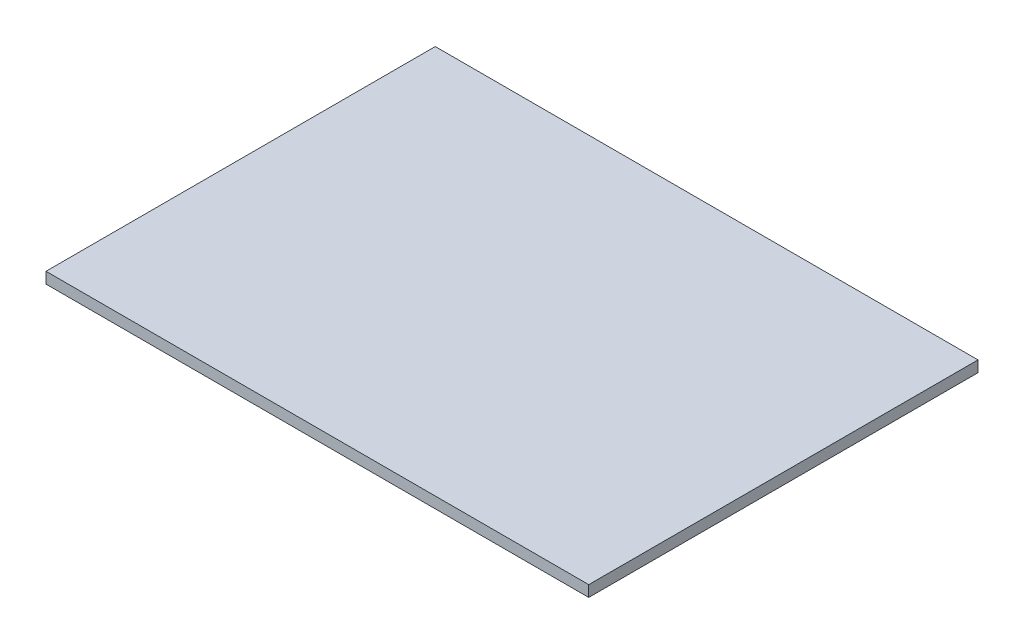
ISO-10303-21;
HEADER;
FILE_DESCRIPTION(('STEP AP214'),'2;1');
FILE_NAME('part.step','',(''),(''),'','','');
FILE_SCHEMA(('AUTOMOTIVE_DESIGN { 1 0 10303 214 1 1 1 1 }'));
ENDSEC;
DATA;
#1=APPLICATION_CONTEXT('core data for automotive mechanical design processes');
#2=APPLICATION_PROTOCOL_DEFINITION('international standard','automotive_design',2000,#1);
#3=PRODUCT_CONTEXT('',#1,'mechanical');
#4=PRODUCT('Part','Part','',(#3));
#5=PRODUCT_RELATED_PRODUCT_CATEGORY('part','',(#4));
#6=PRODUCT_DEFINITION_FORMATION('','',#4);
#7=PRODUCT_DEFINITION_CONTEXT('part definition',#1,'design');
#8=PRODUCT_DEFINITION('design','',#6,#7);
#9=PRODUCT_DEFINITION_SHAPE('','',#8);
#10=(LENGTH_UNIT() NAMED_UNIT(*) SI_UNIT(.MILLI.,.METRE.));
#11=(NAMED_UNIT(*) PLANE_ANGLE_UNIT() SI_UNIT($,.RADIAN.));
#12=(NAMED_UNIT(*) SI_UNIT($,.STERADIAN.) SOLID_ANGLE_UNIT());
#13=UNCERTAINTY_MEASURE_WITH_UNIT(LENGTH_MEASURE(1.E-05),#10,'distance_accuracy_value','');
#14=(GEOMETRIC_REPRESENTATION_CONTEXT(3) GLOBAL_UNCERTAINTY_ASSIGNED_CONTEXT((#13)) GLOBAL_UNIT_ASSIGNED_CONTEXT((#10,
#11,#12)) REPRESENTATION_CONTEXT('',''));
#15=CARTESIAN_POINT('',(0.,0.,0.));
#16=DIRECTION('',(0.,0.,1.));
#17=DIRECTION('',(1.,0.,0.));
#18=AXIS2_PLACEMENT_3D('',#15,#16,#17);
#19=CARTESIAN_POINT('',(0.,5.,0.));
#20=DIRECTION('',(1.,0.,0.));
#21=DIRECTION('',(0.,0.,-1.));
#22=AXIS2_PLACEMENT_3D('',#19,#20,#21);
#23=PLANE('',#22);
#24=DIRECTION('',(0.,0.,1.));
#25=VECTOR('',#24,1.);
#26=CARTESIAN_POINT('',(0.,0.,0.));
#27=LINE('',#26,#25);
#28=CARTESIAN_POINT('',(0.,0.,0.));
#29=VERTEX_POINT('',#28);
#30=CARTESIAN_POINT('',(0.,0.,175.));
#31=VERTEX_POINT('',#30);
#32=EDGE_CURVE('E98',#29,#31,#27,.T.);
#33=ORIENTED_EDGE('',*,*,#32,.T.);
#34=DIRECTION('',(0.,-1.,0.));
#35=VECTOR('',#34,1.);
#36=CARTESIAN_POINT('',(0.,5.,175.));
#37=LINE('',#36,#35);
#38=CARTESIAN_POINT('',(0.,5.,175.));
#39=VERTEX_POINT('',#38);
#40=EDGE_CURVE('E11',#39,#31,#37,.T.);
#41=ORIENTED_EDGE('',*,*,#40,.F.);
#42=DIRECTION('',(0.,0.,1.));
#43=VECTOR('',#42,1.);
#44=CARTESIAN_POINT('',(0.,5.,0.));
#45=LINE('',#44,#43);
#46=CARTESIAN_POINT('',(0.,5.,0.));
#47=VERTEX_POINT('',#46);
#48=EDGE_CURVE('E86',#47,#39,#45,.T.);
#49=ORIENTED_EDGE('',*,*,#48,.F.);
#50=DIRECTION('',(0.,-1.,0.));
#51=VECTOR('',#50,1.);
#52=CARTESIAN_POINT('',(0.,5.,0.));
#53=LINE('',#52,#51);
#54=EDGE_CURVE('E94',#47,#29,#53,.T.);
#55=ORIENTED_EDGE('',*,*,#54,.T.);
#56=EDGE_LOOP('',(#33,#41,#49,#55));
#57=FACE_BOUND('',#56,.T.);
#58=ADVANCED_FACE('F35',(#57),#23,.F.);
#59=CARTESIAN_POINT('',(0.,5.,175.));
#60=DIRECTION('',(0.,0.,-1.));
#61=DIRECTION('',(-1.,0.,0.));
#62=AXIS2_PLACEMENT_3D('',#59,#60,#61);
#63=PLANE('',#62);
#64=DIRECTION('',(1.,0.,0.));
#65=VECTOR('',#64,1.);
#66=CARTESIAN_POINT('',(0.,0.,175.));
#67=LINE('',#66,#65);
#68=CARTESIAN_POINT('',(244.,0.,175.));
#69=VERTEX_POINT('',#68);
#70=EDGE_CURVE('E90',#31,#69,#67,.T.);
#71=ORIENTED_EDGE('',*,*,#70,.T.);
#72=DIRECTION('',(0.,-1.,0.));
#73=VECTOR('',#72,1.);
#74=CARTESIAN_POINT('',(244.,5.,175.));
#75=LINE('',#74,#73);
#76=CARTESIAN_POINT('',(244.,5.,175.));
#77=VERTEX_POINT('',#76);
#78=EDGE_CURVE('E43',#77,#69,#75,.T.);
#79=ORIENTED_EDGE('',*,*,#78,.F.);
#80=DIRECTION('',(1.,0.,0.));
#81=VECTOR('',#80,1.);
#82=CARTESIAN_POINT('',(0.,5.,175.));
#83=LINE('',#82,#81);
#84=EDGE_CURVE('E81',#39,#77,#83,.T.);
#85=ORIENTED_EDGE('',*,*,#84,.F.);
#86=ORIENTED_EDGE('',*,*,#40,.T.);
#87=EDGE_LOOP('',(#71,#79,#85,#86));
#88=FACE_BOUND('',#87,.T.);
#89=ADVANCED_FACE('F89',(#88),#63,.F.);
#90=CARTESIAN_POINT('',(244.,5.,0.));
#91=DIRECTION('',(-1.,0.,0.));
#92=DIRECTION('',(0.,0.,1.));
#93=AXIS2_PLACEMENT_3D('',#90,#91,#92);
#94=PLANE('',#93);
#95=DIRECTION('',(0.,0.,-1.));
#96=VECTOR('',#95,1.);
#97=CARTESIAN_POINT('',(244.,0.,0.));
#98=LINE('',#97,#96);
#99=CARTESIAN_POINT('',(244.,0.,0.));
#100=VERTEX_POINT('',#99);
#101=EDGE_CURVE('E68',#69,#100,#98,.T.);
#102=ORIENTED_EDGE('',*,*,#101,.T.);
#103=DIRECTION('',(0.,-1.,0.));
#104=VECTOR('',#103,1.);
#105=CARTESIAN_POINT('',(244.,5.,0.));
#106=LINE('',#105,#104);
#107=CARTESIAN_POINT('',(244.,5.,0.));
#108=VERTEX_POINT('',#107);
#109=EDGE_CURVE('E91',#108,#100,#106,.T.);
#110=ORIENTED_EDGE('',*,*,#109,.F.);
#111=DIRECTION('',(0.,0.,-1.));
#112=VECTOR('',#111,1.);
#113=CARTESIAN_POINT('',(244.,5.,0.));
#114=LINE('',#113,#112);
#115=EDGE_CURVE('E84',#77,#108,#114,.T.);
#116=ORIENTED_EDGE('',*,*,#115,.F.);
#117=ORIENTED_EDGE('',*,*,#78,.T.);
#118=EDGE_LOOP('',(#102,#110,#116,#117));
#119=FACE_BOUND('',#118,.T.);
#120=ADVANCED_FACE('F92',(#119),#94,.F.);
#121=CARTESIAN_POINT('',(0.,5.,0.));
#122=DIRECTION('',(0.,0.,1.));
#123=DIRECTION('',(1.,0.,0.));
#124=AXIS2_PLACEMENT_3D('',#121,#122,#123);
#125=PLANE('',#124);
#126=DIRECTION('',(-1.,0.,0.));
#127=VECTOR('',#126,1.);
#128=CARTESIAN_POINT('',(0.,0.,0.));
#129=LINE('',#128,#127);
#130=EDGE_CURVE('E74',#100,#29,#129,.T.);
#131=ORIENTED_EDGE('',*,*,#130,.T.);
#132=ORIENTED_EDGE('',*,*,#54,.F.);
#133=DIRECTION('',(-1.,0.,0.));
#134=VECTOR('',#133,1.);
#135=CARTESIAN_POINT('',(0.,5.,0.));
#136=LINE('',#135,#134);
#137=EDGE_CURVE('E51',#108,#47,#136,.T.);
#138=ORIENTED_EDGE('',*,*,#137,.F.);
#139=ORIENTED_EDGE('',*,*,#109,.T.);
#140=EDGE_LOOP('',(#131,#132,#138,#139));
#141=FACE_BOUND('',#140,.T.);
#142=ADVANCED_FACE('F105',(#141),#125,.F.);
#143=CARTESIAN_POINT('',(0.,5.,0.));
#144=DIRECTION('',(0.,1.,0.));
#145=DIRECTION('',(0.,0.,1.));
#146=AXIS2_PLACEMENT_3D('',#143,#144,#145);
#147=PLANE('',#146);
#148=ORIENTED_EDGE('',*,*,#48,.T.);
#149=ORIENTED_EDGE('',*,*,#84,.T.);
#150=ORIENTED_EDGE('',*,*,#115,.T.);
#151=ORIENTED_EDGE('',*,*,#137,.T.);
#152=EDGE_LOOP('',(#148,#149,#150,#151));
#153=FACE_BOUND('',#152,.T.);
#154=ADVANCED_FACE('F82',(#153),#147,.T.);
#155=CARTESIAN_POINT('',(0.,0.,0.));
#156=DIRECTION('',(0.,1.,0.));
#157=DIRECTION('',(0.,0.,1.));
#158=AXIS2_PLACEMENT_3D('',#155,#156,#157);
#159=PLANE('',#158);
#160=ORIENTED_EDGE('',*,*,#32,.F.);
#161=ORIENTED_EDGE('',*,*,#130,.F.);
#162=ORIENTED_EDGE('',*,*,#101,.F.);
#163=ORIENTED_EDGE('',*,*,#70,.F.);
#164=EDGE_LOOP('',(#160,#161,#162,#163));
#165=FACE_BOUND('',#164,.T.);
#166=ADVANCED_FACE('F108',(#165),#159,.F.);
#167=CLOSED_SHELL('',(#58,#89,#120,#142,#154,#166));
#168=MANIFOLD_SOLID_BREP('B2',#167);
#169=ADVANCED_BREP_SHAPE_REPRESENTATION('',(#18,#168),#14);
#170=SHAPE_DEFINITION_REPRESENTATION(#9,#169);
ENDSEC;
END-ISO-10303-21;
